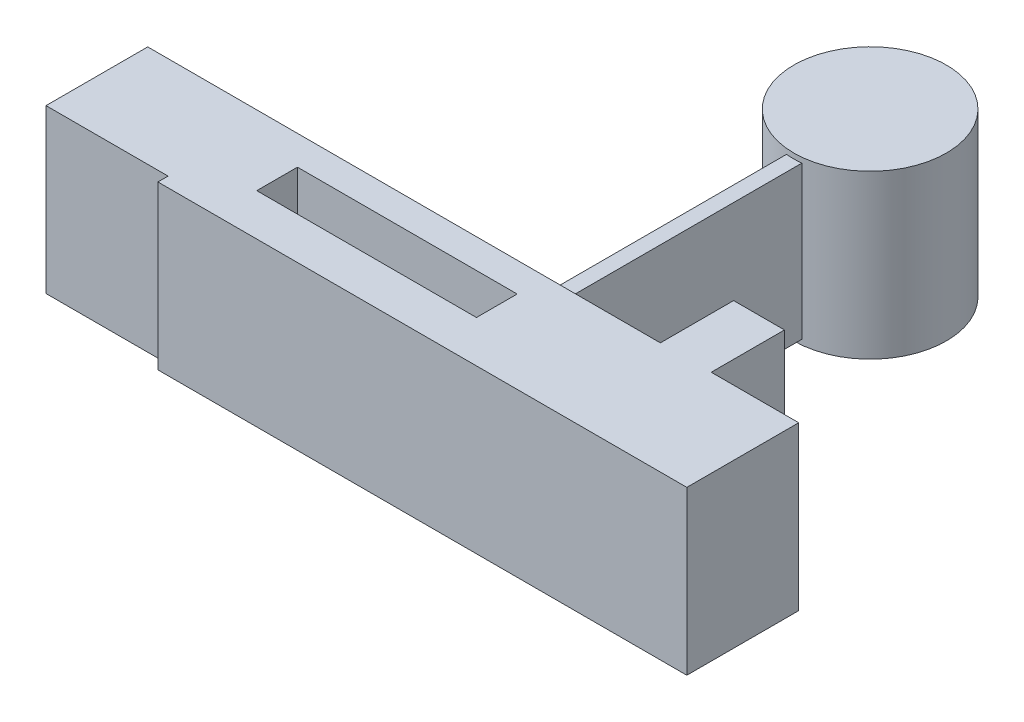
ISO-10303-21;
HEADER;
FILE_DESCRIPTION(('STEP AP214'),'2;1');
FILE_NAME('part.step','',(''),(''),'','','');
FILE_SCHEMA(('AUTOMOTIVE_DESIGN { 1 0 10303 214 1 1 1 1 }'));
ENDSEC;
DATA;
#1=APPLICATION_CONTEXT('core data for automotive mechanical design processes');
#2=APPLICATION_PROTOCOL_DEFINITION('international standard','automotive_design',2000,#1);
#3=PRODUCT_CONTEXT('',#1,'mechanical');
#4=PRODUCT('Part','Part','',(#3));
#5=PRODUCT_RELATED_PRODUCT_CATEGORY('part','',(#4));
#6=PRODUCT_DEFINITION_FORMATION('','',#4);
#7=PRODUCT_DEFINITION_CONTEXT('part definition',#1,'design');
#8=PRODUCT_DEFINITION('design','',#6,#7);
#9=PRODUCT_DEFINITION_SHAPE('','',#8);
#10=(LENGTH_UNIT() NAMED_UNIT(*) SI_UNIT(.MILLI.,.METRE.));
#11=(NAMED_UNIT(*) PLANE_ANGLE_UNIT() SI_UNIT($,.RADIAN.));
#12=(NAMED_UNIT(*) SI_UNIT($,.STERADIAN.) SOLID_ANGLE_UNIT());
#13=UNCERTAINTY_MEASURE_WITH_UNIT(LENGTH_MEASURE(1.E-05),#10,'distance_accuracy_value','');
#14=(GEOMETRIC_REPRESENTATION_CONTEXT(3) GLOBAL_UNCERTAINTY_ASSIGNED_CONTEXT((#13)) GLOBAL_UNIT_ASSIGNED_CONTEXT((#10,
#11,#12)) REPRESENTATION_CONTEXT('',''));
#15=CARTESIAN_POINT('',(0.,0.,0.));
#16=DIRECTION('',(0.,0.,1.));
#17=DIRECTION('',(1.,0.,0.));
#18=AXIS2_PLACEMENT_3D('',#15,#16,#17);
#19=CARTESIAN_POINT('',(2.55,0.5,-1.88875));
#20=DIRECTION('',(0.,1.,0.));
#21=DIRECTION('',(1.,0.,0.));
#22=AXIS2_PLACEMENT_3D('',#19,#20,#21);
#23=PLANE('',#22);
#24=CARTESIAN_POINT('',(2.55,0.5,-1.88875));
#25=DIRECTION('',(0.,1.,0.));
#26=DIRECTION('',(0.,0.,1.));
#27=AXIS2_PLACEMENT_3D('',#24,#25,#26);
#28=CIRCLE('',#27,0.46875);
#29=CARTESIAN_POINT('',(2.55,0.5,-1.42));
#30=VERTEX_POINT('',#29);
#31=EDGE_CURVE('E37',#30,#30,#28,.T.);
#32=ORIENTED_EDGE('',*,*,#31,.T.);
#33=EDGE_LOOP('',(#32));
#34=FACE_BOUND('',#33,.T.);
#35=ADVANCED_FACE('F15',(#34),#23,.T.);
#36=CARTESIAN_POINT('',(2.55,-0.5,-1.88875));
#37=DIRECTION('',(0.,1.,0.));
#38=DIRECTION('',(1.,0.,0.));
#39=AXIS2_PLACEMENT_3D('',#36,#37,#38);
#40=PLANE('',#39);
#41=CARTESIAN_POINT('',(2.55,-0.5,-1.88875));
#42=DIRECTION('',(0.,1.,0.));
#43=DIRECTION('',(0.,0.,1.));
#44=AXIS2_PLACEMENT_3D('',#41,#42,#43);
#45=CIRCLE('',#44,0.46875);
#46=CARTESIAN_POINT('',(2.55,-0.5,-1.42));
#47=VERTEX_POINT('',#46);
#48=EDGE_CURVE('E9',#47,#47,#45,.T.);
#49=ORIENTED_EDGE('',*,*,#48,.F.);
#50=EDGE_LOOP('',(#49));
#51=FACE_BOUND('',#50,.T.);
#52=ADVANCED_FACE('F483',(#51),#40,.F.);
#53=CARTESIAN_POINT('',(2.55,-0.5,-1.88875));
#54=DIRECTION('',(0.,1.,0.));
#55=DIRECTION('',(0.,0.,1.));
#56=AXIS2_PLACEMENT_3D('',#53,#54,#55);
#57=CYLINDRICAL_SURFACE('',#56,0.46875);
#58=DIRECTION('',(0.,1.,0.));
#59=VECTOR('',#58,1.);
#60=CARTESIAN_POINT('',(2.55,-0.5,-1.42));
#61=LINE('',#60,#59);
#62=CARTESIAN_POINT('',(2.55,0.46875,-1.42));
#63=VERTEX_POINT('',#62);
#64=EDGE_CURVE('E412',#63,#30,#61,.T.);
#65=ORIENTED_EDGE('',*,*,#64,.T.);
#66=ORIENTED_EDGE('',*,*,#31,.F.);
#67=ORIENTED_EDGE('',*,*,#64,.F.);
#68=CARTESIAN_POINT('',(2.55,0.46875,-1.88875));
#69=DIRECTION('',(0.,1.,0.));
#70=DIRECTION('',(0.,0.,1.));
#71=AXIS2_PLACEMENT_3D('',#68,#69,#70);
#72=CIRCLE('',#71,0.46875);
#73=CARTESIAN_POINT('',(2.596875,0.46875,-1.422349638856));
#74=VERTEX_POINT('',#73);
#75=EDGE_CURVE('E388',#63,#74,#72,.T.);
#76=ORIENTED_EDGE('',*,*,#75,.T.);
#77=DIRECTION('',(0.,1.,0.));
#78=VECTOR('',#77,1.);
#79=CARTESIAN_POINT('',(2.596875,-0.5,-1.422349638856));
#80=LINE('',#79,#78);
#81=CARTESIAN_POINT('',(2.596875,-0.46875,-1.422349638856));
#82=VERTEX_POINT('',#81);
#83=EDGE_CURVE('E404',#82,#74,#80,.T.);
#84=ORIENTED_EDGE('',*,*,#83,.F.);
#85=CARTESIAN_POINT('',(2.55,-0.46875,-1.88875));
#86=DIRECTION('',(0.,1.,0.));
#87=DIRECTION('',(0.,0.,1.));
#88=AXIS2_PLACEMENT_3D('',#85,#86,#87);
#89=CIRCLE('',#88,0.46875);
#90=CARTESIAN_POINT('',(2.55,-0.46875,-1.42));
#91=VERTEX_POINT('',#90);
#92=EDGE_CURVE('E398',#91,#82,#89,.T.);
#93=ORIENTED_EDGE('',*,*,#92,.F.);
#94=DIRECTION('',(0.,1.,0.));
#95=VECTOR('',#94,1.);
#96=CARTESIAN_POINT('',(2.55,-0.5,-1.42));
#97=LINE('',#96,#95);
#98=EDGE_CURVE('E23',#47,#91,#97,.T.);
#99=ORIENTED_EDGE('',*,*,#98,.F.);
#100=ORIENTED_EDGE('',*,*,#48,.T.);
#101=ORIENTED_EDGE('',*,*,#98,.T.);
#102=CARTESIAN_POINT('',(2.55,-0.46875,-1.88875));
#103=DIRECTION('',(0.,1.,0.));
#104=DIRECTION('',(0.,0.,1.));
#105=AXIS2_PLACEMENT_3D('',#102,#103,#104);
#106=CIRCLE('',#105,0.46875);
#107=CARTESIAN_POINT('',(2.503125,-0.46875,-1.422349638856));
#108=VERTEX_POINT('',#107);
#109=EDGE_CURVE('E393',#108,#91,#106,.T.);
#110=ORIENTED_EDGE('',*,*,#109,.F.);
#111=DIRECTION('',(0.,1.,0.));
#112=VECTOR('',#111,1.);
#113=CARTESIAN_POINT('',(2.503125,-0.5,-1.422349638856));
#114=LINE('',#113,#112);
#115=CARTESIAN_POINT('',(2.503125,0.46875,-1.422349638856));
#116=VERTEX_POINT('',#115);
#117=EDGE_CURVE('E379',#108,#116,#114,.T.);
#118=ORIENTED_EDGE('',*,*,#117,.T.);
#119=CARTESIAN_POINT('',(2.55,0.46875,-1.88875));
#120=DIRECTION('',(0.,1.,0.));
#121=DIRECTION('',(0.,0.,1.));
#122=AXIS2_PLACEMENT_3D('',#119,#120,#121);
#123=CIRCLE('',#122,0.46875);
#124=EDGE_CURVE('E240',#116,#63,#123,.T.);
#125=ORIENTED_EDGE('',*,*,#124,.T.);
#126=EDGE_LOOP('',(#65,#66,#67,#76,#84,#93,#99,#100,#101,#110,#118,#125));
#127=FACE_BOUND('',#126,.T.);
#128=ADVANCED_FACE('F420',(#127),#57,.T.);
#129=CARTESIAN_POINT('',(3.4625,-0.5,-0.45));
#130=DIRECTION('',(1.,0.,0.));
#131=DIRECTION('',(0.,1.,0.));
#132=AXIS2_PLACEMENT_3D('',#129,#130,#131);
#133=PLANE('',#132);
#134=DIRECTION('',(0.,0.,1.));
#135=VECTOR('',#134,1.);
#136=CARTESIAN_POINT('',(3.4625,-0.5,-0.45));
#137=LINE('',#136,#135);
#138=CARTESIAN_POINT('',(3.4625,-0.5,-0.45));
#139=VERTEX_POINT('',#138);
#140=CARTESIAN_POINT('',(3.4625,-0.5,0.));
#141=VERTEX_POINT('',#140);
#142=EDGE_CURVE('E256',#139,#141,#137,.T.);
#143=ORIENTED_EDGE('',*,*,#142,.F.);
#144=DIRECTION('',(0.,1.,0.));
#145=VECTOR('',#144,1.);
#146=CARTESIAN_POINT('',(3.4625,-0.5,-0.45));
#147=LINE('',#146,#145);
#148=CARTESIAN_POINT('',(3.4625,0.5,-0.45));
#149=VERTEX_POINT('',#148);
#150=EDGE_CURVE('E407',#139,#149,#147,.T.);
#151=ORIENTED_EDGE('',*,*,#150,.T.);
#152=DIRECTION('',(0.,0.,1.));
#153=VECTOR('',#152,1.);
#154=CARTESIAN_POINT('',(3.4625,0.5,-0.45));
#155=LINE('',#154,#153);
#156=CARTESIAN_POINT('',(3.4625,0.5,0.));
#157=VERTEX_POINT('',#156);
#158=EDGE_CURVE('E317',#149,#157,#155,.T.);
#159=ORIENTED_EDGE('',*,*,#158,.T.);
#160=DIRECTION('',(0.,1.,0.));
#161=VECTOR('',#160,1.);
#162=CARTESIAN_POINT('',(3.4625,-0.5,0.));
#163=LINE('',#162,#161);
#164=EDGE_CURVE('E239',#141,#157,#163,.T.);
#165=ORIENTED_EDGE('',*,*,#164,.F.);
#166=EDGE_LOOP('',(#143,#151,#159,#165));
#167=FACE_BOUND('',#166,.T.);
#168=ADVANCED_FACE('F456',(#167),#133,.T.);
#169=CARTESIAN_POINT('',(3.15,-0.5,-0.45));
#170=DIRECTION('',(0.,0.,1.));
#171=DIRECTION('',(1.,0.,0.));
#172=AXIS2_PLACEMENT_3D('',#169,#170,#171);
#173=PLANE('',#172);
#174=DIRECTION('',(1.,0.,0.));
#175=VECTOR('',#174,1.);
#176=CARTESIAN_POINT('',(3.15,0.5,-0.45));
#177=LINE('',#176,#175);
#178=CARTESIAN_POINT('',(3.15,0.5,-0.45));
#179=VERTEX_POINT('',#178);
#180=EDGE_CURVE('E323',#179,#149,#177,.T.);
#181=ORIENTED_EDGE('',*,*,#180,.T.);
#182=ORIENTED_EDGE('',*,*,#150,.F.);
#183=DIRECTION('',(1.,0.,0.));
#184=VECTOR('',#183,1.);
#185=CARTESIAN_POINT('',(3.15,-0.5,-0.45));
#186=LINE('',#185,#184);
#187=CARTESIAN_POINT('',(3.15,-0.5,-0.45));
#188=VERTEX_POINT('',#187);
#189=EDGE_CURVE('E260',#188,#139,#186,.T.);
#190=ORIENTED_EDGE('',*,*,#189,.F.);
#191=DIRECTION('',(0.,1.,0.));
#192=VECTOR('',#191,1.);
#193=CARTESIAN_POINT('',(3.15,-0.5,-0.45));
#194=LINE('',#193,#192);
#195=EDGE_CURVE('E372',#188,#179,#194,.T.);
#196=ORIENTED_EDGE('',*,*,#195,.T.);
#197=EDGE_LOOP('',(#181,#182,#190,#196));
#198=FACE_BOUND('',#197,.T.);
#199=ADVANCED_FACE('F453',(#198),#173,.F.);
#200=CARTESIAN_POINT('',(2.596875,-0.46875,-1.5));
#201=DIRECTION('',(1.,0.,0.));
#202=DIRECTION('',(0.,1.,0.));
#203=AXIS2_PLACEMENT_3D('',#200,#201,#202);
#204=PLANE('',#203);
#205=DIRECTION('',(0.,0.,1.));
#206=VECTOR('',#205,1.);
#207=CARTESIAN_POINT('',(2.596875,-0.46875,-1.5));
#208=LINE('',#207,#206);
#209=CARTESIAN_POINT('',(2.596875,-0.46875,0.));
#210=VERTEX_POINT('',#209);
#211=EDGE_CURVE('E401',#82,#210,#208,.T.);
#212=ORIENTED_EDGE('',*,*,#211,.F.);
#213=ORIENTED_EDGE('',*,*,#83,.T.);
#214=DIRECTION('',(0.,0.,1.));
#215=VECTOR('',#214,1.);
#216=CARTESIAN_POINT('',(2.596875,0.46875,-1.5));
#217=LINE('',#216,#215);
#218=CARTESIAN_POINT('',(2.596875,0.46875,0.));
#219=VERTEX_POINT('',#218);
#220=EDGE_CURVE('E390',#74,#219,#217,.T.);
#221=ORIENTED_EDGE('',*,*,#220,.T.);
#222=DIRECTION('',(0.,1.,0.));
#223=VECTOR('',#222,1.);
#224=CARTESIAN_POINT('',(2.596875,-0.46875,0.));
#225=LINE('',#224,#223);
#226=EDGE_CURVE('E351',#210,#219,#225,.T.);
#227=ORIENTED_EDGE('',*,*,#226,.F.);
#228=EDGE_LOOP('',(#212,#213,#221,#227));
#229=FACE_BOUND('',#228,.T.);
#230=ADVANCED_FACE('F437',(#229),#204,.T.);
#231=CARTESIAN_POINT('',(2.503125,-0.46875,-1.5));
#232=DIRECTION('',(0.,1.,0.));
#233=DIRECTION('',(1.,0.,0.));
#234=AXIS2_PLACEMENT_3D('',#231,#232,#233);
#235=PLANE('',#234);
#236=DIRECTION('',(1.,0.,0.));
#237=VECTOR('',#236,1.);
#238=CARTESIAN_POINT('',(2.503125,-0.46875,0.));
#239=LINE('',#238,#237);
#240=CARTESIAN_POINT('',(2.503125,-0.46875,0.));
#241=VERTEX_POINT('',#240);
#242=EDGE_CURVE('E346',#241,#210,#239,.T.);
#243=ORIENTED_EDGE('',*,*,#242,.F.);
#244=DIRECTION('',(0.,0.,1.));
#245=VECTOR('',#244,1.);
#246=CARTESIAN_POINT('',(2.503125,-0.46875,-1.5));
#247=LINE('',#246,#245);
#248=EDGE_CURVE('E383',#108,#241,#247,.T.);
#249=ORIENTED_EDGE('',*,*,#248,.F.);
#250=ORIENTED_EDGE('',*,*,#109,.T.);
#251=ORIENTED_EDGE('',*,*,#92,.T.);
#252=ORIENTED_EDGE('',*,*,#211,.T.);
#253=EDGE_LOOP('',(#243,#249,#250,#251,#252));
#254=FACE_BOUND('',#253,.T.);
#255=ADVANCED_FACE('F424',(#254),#235,.F.);
#256=CARTESIAN_POINT('',(2.503125,0.46875,-1.5));
#257=DIRECTION('',(0.,1.,0.));
#258=DIRECTION('',(1.,0.,0.));
#259=AXIS2_PLACEMENT_3D('',#256,#257,#258);
#260=PLANE('',#259);
#261=ORIENTED_EDGE('',*,*,#220,.F.);
#262=ORIENTED_EDGE('',*,*,#75,.F.);
#263=ORIENTED_EDGE('',*,*,#124,.F.);
#264=DIRECTION('',(0.,0.,1.));
#265=VECTOR('',#264,1.);
#266=CARTESIAN_POINT('',(2.503125,0.46875,-1.5));
#267=LINE('',#266,#265);
#268=CARTESIAN_POINT('',(2.503125,0.46875,0.));
#269=VERTEX_POINT('',#268);
#270=EDGE_CURVE('E380',#116,#269,#267,.T.);
#271=ORIENTED_EDGE('',*,*,#270,.T.);
#272=DIRECTION('',(1.,0.,0.));
#273=VECTOR('',#272,1.);
#274=CARTESIAN_POINT('',(2.503125,0.46875,0.));
#275=LINE('',#274,#273);
#276=EDGE_CURVE('E354',#269,#219,#275,.T.);
#277=ORIENTED_EDGE('',*,*,#276,.T.);
#278=EDGE_LOOP('',(#261,#262,#263,#271,#277));
#279=FACE_BOUND('',#278,.T.);
#280=ADVANCED_FACE('F432',(#279),#260,.T.);
#281=CARTESIAN_POINT('',(2.503125,-0.46875,-1.5));
#282=DIRECTION('',(1.,0.,0.));
#283=DIRECTION('',(0.,1.,0.));
#284=AXIS2_PLACEMENT_3D('',#281,#282,#283);
#285=PLANE('',#284);
#286=DIRECTION('',(0.,1.,0.));
#287=VECTOR('',#286,1.);
#288=CARTESIAN_POINT('',(2.503125,-0.46875,0.));
#289=LINE('',#288,#287);
#290=EDGE_CURVE('E282',#241,#269,#289,.T.);
#291=ORIENTED_EDGE('',*,*,#290,.T.);
#292=ORIENTED_EDGE('',*,*,#270,.F.);
#293=ORIENTED_EDGE('',*,*,#117,.F.);
#294=ORIENTED_EDGE('',*,*,#248,.T.);
#295=EDGE_LOOP('',(#291,#292,#293,#294));
#296=FACE_BOUND('',#295,.T.);
#297=ADVANCED_FACE('F427',(#296),#285,.F.);
#298=CARTESIAN_POINT('',(3.15,-0.5,-0.45));
#299=DIRECTION('',(1.,0.,0.));
#300=DIRECTION('',(0.,1.,0.));
#301=AXIS2_PLACEMENT_3D('',#298,#299,#300);
#302=PLANE('',#301);
#303=DIRECTION('',(0.,1.,0.));
#304=VECTOR('',#303,1.);
#305=CARTESIAN_POINT('',(3.15,-0.5,0.));
#306=LINE('',#305,#304);
#307=CARTESIAN_POINT('',(3.15,-0.5,0.));
#308=VERTEX_POINT('',#307);
#309=CARTESIAN_POINT('',(3.15,0.5,0.));
#310=VERTEX_POINT('',#309);
#311=EDGE_CURVE('E342',#308,#310,#306,.T.);
#312=ORIENTED_EDGE('',*,*,#311,.T.);
#313=DIRECTION('',(0.,0.,1.));
#314=VECTOR('',#313,1.);
#315=CARTESIAN_POINT('',(3.15,0.5,-0.45));
#316=LINE('',#315,#314);
#317=EDGE_CURVE('E330',#179,#310,#316,.T.);
#318=ORIENTED_EDGE('',*,*,#317,.F.);
#319=ORIENTED_EDGE('',*,*,#195,.F.);
#320=DIRECTION('',(0.,0.,1.));
#321=VECTOR('',#320,1.);
#322=CARTESIAN_POINT('',(3.15,-0.5,-0.45));
#323=LINE('',#322,#321);
#324=EDGE_CURVE('E219',#188,#308,#323,.T.);
#325=ORIENTED_EDGE('',*,*,#324,.T.);
#326=EDGE_LOOP('',(#312,#318,#319,#325));
#327=FACE_BOUND('',#326,.T.);
#328=ADVANCED_FACE('F448',(#327),#302,.F.);
#329=CARTESIAN_POINT('',(1.1,-0.55,0.18));
#330=DIRECTION('',(1.,0.,0.));
#331=DIRECTION('',(0.,1.,0.));
#332=AXIS2_PLACEMENT_3D('',#329,#330,#331);
#333=PLANE('',#332);
#334=DIRECTION('',(0.,1.,0.));
#335=VECTOR('',#334,1.);
#336=CARTESIAN_POINT('',(1.1,-0.55,0.43));
#337=LINE('',#336,#335);
#338=CARTESIAN_POINT('',(1.1,-0.5,0.43));
#339=VERTEX_POINT('',#338);
#340=CARTESIAN_POINT('',(1.1,0.5,0.43));
#341=VERTEX_POINT('',#340);
#342=EDGE_CURVE('E250',#339,#341,#337,.T.);
#343=ORIENTED_EDGE('',*,*,#342,.F.);
#344=DIRECTION('',(0.,0.,-1.));
#345=VECTOR('',#344,1.);
#346=CARTESIAN_POINT('',(1.1,-0.5,0.09));
#347=LINE('',#346,#345);
#348=CARTESIAN_POINT('',(1.1,-0.5,0.18));
#349=VERTEX_POINT('',#348);
#350=EDGE_CURVE('E249',#339,#349,#347,.T.);
#351=ORIENTED_EDGE('',*,*,#350,.T.);
#352=DIRECTION('',(0.,1.,0.));
#353=VECTOR('',#352,1.);
#354=CARTESIAN_POINT('',(1.1,-0.55,0.18));
#355=LINE('',#354,#353);
#356=CARTESIAN_POINT('',(1.1,0.5,0.18));
#357=VERTEX_POINT('',#356);
#358=EDGE_CURVE('E371',#349,#357,#355,.T.);
#359=ORIENTED_EDGE('',*,*,#358,.T.);
#360=DIRECTION('',(0.,0.,-1.));
#361=VECTOR('',#360,1.);
#362=CARTESIAN_POINT('',(1.1,0.5,0.09));
#363=LINE('',#362,#361);
#364=EDGE_CURVE('E273',#341,#357,#363,.T.);
#365=ORIENTED_EDGE('',*,*,#364,.F.);
#366=EDGE_LOOP('',(#343,#351,#359,#365));
#367=FACE_BOUND('',#366,.T.);
#368=ADVANCED_FACE('F510',(#367),#333,.T.);
#369=CARTESIAN_POINT('',(1.1,-0.55,0.18));
#370=DIRECTION('',(0.,0.,1.));
#371=DIRECTION('',(1.,0.,0.));
#372=AXIS2_PLACEMENT_3D('',#369,#370,#371);
#373=PLANE('',#372);
#374=ORIENTED_EDGE('',*,*,#358,.F.);
#375=DIRECTION('',(1.,0.,0.));
#376=VECTOR('',#375,1.);
#377=CARTESIAN_POINT('',(0.55,-0.5,0.18));
#378=LINE('',#377,#376);
#379=CARTESIAN_POINT('',(2.45,-0.5,0.18));
#380=VERTEX_POINT('',#379);
#381=EDGE_CURVE('E252',#349,#380,#378,.T.);
#382=ORIENTED_EDGE('',*,*,#381,.T.);
#383=DIRECTION('',(0.,1.,0.));
#384=VECTOR('',#383,1.);
#385=CARTESIAN_POINT('',(2.45,-0.55,0.18));
#386=LINE('',#385,#384);
#387=CARTESIAN_POINT('',(2.45,0.5,0.18));
#388=VERTEX_POINT('',#387);
#389=EDGE_CURVE('E366',#380,#388,#386,.T.);
#390=ORIENTED_EDGE('',*,*,#389,.T.);
#391=DIRECTION('',(1.,0.,0.));
#392=VECTOR('',#391,1.);
#393=CARTESIAN_POINT('',(0.55,0.5,0.18));
#394=LINE('',#393,#392);
#395=EDGE_CURVE('E267',#357,#388,#394,.T.);
#396=ORIENTED_EDGE('',*,*,#395,.F.);
#397=EDGE_LOOP('',(#374,#382,#390,#396));
#398=FACE_BOUND('',#397,.T.);
#399=ADVANCED_FACE('F512',(#398),#373,.T.);
#400=CARTESIAN_POINT('',(2.45,-0.55,0.18));
#401=DIRECTION('',(1.,0.,0.));
#402=DIRECTION('',(0.,1.,0.));
#403=AXIS2_PLACEMENT_3D('',#400,#401,#402);
#404=PLANE('',#403);
#405=DIRECTION('',(0.,0.,-1.));
#406=VECTOR('',#405,1.);
#407=CARTESIAN_POINT('',(2.45,0.5,0.09));
#408=LINE('',#407,#406);
#409=CARTESIAN_POINT('',(2.45,0.5,0.43));
#410=VERTEX_POINT('',#409);
#411=EDGE_CURVE('E272',#410,#388,#408,.T.);
#412=ORIENTED_EDGE('',*,*,#411,.T.);
#413=ORIENTED_EDGE('',*,*,#389,.F.);
#414=DIRECTION('',(0.,0.,-1.));
#415=VECTOR('',#414,1.);
#416=CARTESIAN_POINT('',(2.45,-0.5,0.09));
#417=LINE('',#416,#415);
#418=CARTESIAN_POINT('',(2.45,-0.5,0.43));
#419=VERTEX_POINT('',#418);
#420=EDGE_CURVE('E268',#419,#380,#417,.T.);
#421=ORIENTED_EDGE('',*,*,#420,.F.);
#422=DIRECTION('',(0.,1.,0.));
#423=VECTOR('',#422,1.);
#424=CARTESIAN_POINT('',(2.45,-0.55,0.43));
#425=LINE('',#424,#423);
#426=EDGE_CURVE('E243',#419,#410,#425,.T.);
#427=ORIENTED_EDGE('',*,*,#426,.T.);
#428=EDGE_LOOP('',(#412,#413,#421,#427));
#429=FACE_BOUND('',#428,.T.);
#430=ADVANCED_FACE('F515',(#429),#404,.F.);
#431=CARTESIAN_POINT('',(1.1,-0.55,0.43));
#432=DIRECTION('',(0.,0.,1.));
#433=DIRECTION('',(1.,0.,0.));
#434=AXIS2_PLACEMENT_3D('',#431,#432,#433);
#435=PLANE('',#434);
#436=DIRECTION('',(1.,0.,0.));
#437=VECTOR('',#436,1.);
#438=CARTESIAN_POINT('',(0.55,0.5,0.43));
#439=LINE('',#438,#437);
#440=EDGE_CURVE('E331',#341,#410,#439,.T.);
#441=ORIENTED_EDGE('',*,*,#440,.T.);
#442=ORIENTED_EDGE('',*,*,#426,.F.);
#443=DIRECTION('',(1.,0.,0.));
#444=VECTOR('',#443,1.);
#445=CARTESIAN_POINT('',(0.55,-0.5,0.43));
#446=LINE('',#445,#444);
#447=EDGE_CURVE('E253',#339,#419,#446,.T.);
#448=ORIENTED_EDGE('',*,*,#447,.F.);
#449=ORIENTED_EDGE('',*,*,#342,.T.);
#450=EDGE_LOOP('',(#441,#442,#448,#449));
#451=FACE_BOUND('',#450,.T.);
#452=ADVANCED_FACE('F509',(#451),#435,.F.);
#453=CARTESIAN_POINT('',(0.75,-0.5,0.));
#454=DIRECTION('',(1.,0.,0.));
#455=DIRECTION('',(0.,1.,0.));
#456=AXIS2_PLACEMENT_3D('',#453,#454,#455);
#457=PLANE('',#456);
#458=DIRECTION('',(0.,1.,0.));
#459=VECTOR('',#458,1.);
#460=CARTESIAN_POINT('',(0.75,-0.5,0.6875));
#461=LINE('',#460,#459);
#462=CARTESIAN_POINT('',(0.75,-0.5,0.6875));
#463=VERTEX_POINT('',#462);
#464=CARTESIAN_POINT('',(0.75,0.5,0.6875));
#465=VERTEX_POINT('',#464);
#466=EDGE_CURVE('E237',#463,#465,#461,.T.);
#467=ORIENTED_EDGE('',*,*,#466,.T.);
#468=DIRECTION('',(0.,0.,1.));
#469=VECTOR('',#468,1.);
#470=CARTESIAN_POINT('',(0.75,0.5,0.));
#471=LINE('',#470,#469);
#472=CARTESIAN_POINT('',(0.75,0.5,0.625));
#473=VERTEX_POINT('',#472);
#474=EDGE_CURVE('E304',#473,#465,#471,.T.);
#475=ORIENTED_EDGE('',*,*,#474,.F.);
#476=DIRECTION('',(0.,1.,0.));
#477=VECTOR('',#476,1.);
#478=CARTESIAN_POINT('',(0.75,-0.5,0.625));
#479=LINE('',#478,#477);
#480=CARTESIAN_POINT('',(0.75,-0.5,0.625));
#481=VERTEX_POINT('',#480);
#482=EDGE_CURVE('E297',#481,#473,#479,.T.);
#483=ORIENTED_EDGE('',*,*,#482,.F.);
#484=DIRECTION('',(0.,0.,1.));
#485=VECTOR('',#484,1.);
#486=CARTESIAN_POINT('',(0.75,-0.5,0.));
#487=LINE('',#486,#485);
#488=EDGE_CURVE('E202',#481,#463,#487,.T.);
#489=ORIENTED_EDGE('',*,*,#488,.T.);
#490=EDGE_LOOP('',(#467,#475,#483,#489));
#491=FACE_BOUND('',#490,.T.);
#492=ADVANCED_FACE('F466',(#491),#457,.F.);
#493=CARTESIAN_POINT('',(0.75,-0.5,0.6875));
#494=DIRECTION('',(0.,0.,1.));
#495=DIRECTION('',(1.,0.,0.));
#496=AXIS2_PLACEMENT_3D('',#493,#494,#495);
#497=PLANE('',#496);
#498=ORIENTED_EDGE('',*,*,#466,.F.);
#499=DIRECTION('',(1.,0.,0.));
#500=VECTOR('',#499,1.);
#501=CARTESIAN_POINT('',(0.75,-0.5,0.6875));
#502=LINE('',#501,#500);
#503=CARTESIAN_POINT('',(4.,-0.5,0.6875));
#504=VERTEX_POINT('',#503);
#505=EDGE_CURVE('E286',#463,#504,#502,.T.);
#506=ORIENTED_EDGE('',*,*,#505,.T.);
#507=DIRECTION('',(0.,1.,0.));
#508=VECTOR('',#507,1.);
#509=CARTESIAN_POINT('',(4.,-0.5,0.6875));
#510=LINE('',#509,#508);
#511=CARTESIAN_POINT('',(4.,0.5,0.6875));
#512=VERTEX_POINT('',#511);
#513=EDGE_CURVE('E238',#504,#512,#510,.T.);
#514=ORIENTED_EDGE('',*,*,#513,.T.);
#515=DIRECTION('',(1.,0.,0.));
#516=VECTOR('',#515,1.);
#517=CARTESIAN_POINT('',(0.75,0.5,0.6875));
#518=LINE('',#517,#516);
#519=EDGE_CURVE('E307',#465,#512,#518,.T.);
#520=ORIENTED_EDGE('',*,*,#519,.F.);
#521=EDGE_LOOP('',(#498,#506,#514,#520));
#522=FACE_BOUND('',#521,.T.);
#523=ADVANCED_FACE('F467',(#522),#497,.T.);
#524=CARTESIAN_POINT('',(4.,-0.5,0.));
#525=DIRECTION('',(1.,0.,0.));
#526=DIRECTION('',(0.,1.,0.));
#527=AXIS2_PLACEMENT_3D('',#524,#525,#526);
#528=PLANE('',#527);
#529=DIRECTION('',(0.,0.,1.));
#530=VECTOR('',#529,1.);
#531=CARTESIAN_POINT('',(4.,-0.5,0.));
#532=LINE('',#531,#530);
#533=CARTESIAN_POINT('',(4.,-0.5,0.));
#534=VERTEX_POINT('',#533);
#535=EDGE_CURVE('E279',#534,#504,#532,.T.);
#536=ORIENTED_EDGE('',*,*,#535,.F.);
#537=DIRECTION('',(0.,1.,0.));
#538=VECTOR('',#537,1.);
#539=CARTESIAN_POINT('',(4.,-0.5,0.));
#540=LINE('',#539,#538);
#541=CARTESIAN_POINT('',(4.,0.5,0.));
#542=VERTEX_POINT('',#541);
#543=EDGE_CURVE('E276',#534,#542,#540,.T.);
#544=ORIENTED_EDGE('',*,*,#543,.T.);
#545=DIRECTION('',(0.,0.,1.));
#546=VECTOR('',#545,1.);
#547=CARTESIAN_POINT('',(4.,0.5,0.));
#548=LINE('',#547,#546);
#549=EDGE_CURVE('E313',#542,#512,#548,.T.);
#550=ORIENTED_EDGE('',*,*,#549,.T.);
#551=ORIENTED_EDGE('',*,*,#513,.F.);
#552=EDGE_LOOP('',(#536,#544,#550,#551));
#553=FACE_BOUND('',#552,.T.);
#554=ADVANCED_FACE('F463',(#553),#528,.T.);
#555=CARTESIAN_POINT('',(0.,-0.5,0.));
#556=DIRECTION('',(0.,0.,1.));
#557=DIRECTION('',(1.,0.,0.));
#558=AXIS2_PLACEMENT_3D('',#555,#556,#557);
#559=PLANE('',#558);
#560=ORIENTED_EDGE('',*,*,#543,.F.);
#561=DIRECTION('',(1.,0.,0.));
#562=VECTOR('',#561,1.);
#563=CARTESIAN_POINT('',(0.,-0.5,0.));
#564=LINE('',#563,#562);
#565=EDGE_CURVE('E265',#141,#534,#564,.T.);
#566=ORIENTED_EDGE('',*,*,#565,.F.);
#567=ORIENTED_EDGE('',*,*,#164,.T.);
#568=DIRECTION('',(-1.,0.,0.));
#569=VECTOR('',#568,1.);
#570=CARTESIAN_POINT('',(4.,0.5,0.));
#571=LINE('',#570,#569);
#572=EDGE_CURVE('E312',#542,#157,#571,.T.);
#573=ORIENTED_EDGE('',*,*,#572,.F.);
#574=EDGE_LOOP('',(#560,#566,#567,#573));
#575=FACE_BOUND('',#574,.T.);
#576=ADVANCED_FACE('F441',(#575),#559,.F.);
#577=CARTESIAN_POINT('',(0.,-0.5,0.));
#578=DIRECTION('',(0.,0.,1.));
#579=DIRECTION('',(1.,0.,0.));
#580=AXIS2_PLACEMENT_3D('',#577,#578,#579);
#581=PLANE('',#580);
#582=ORIENTED_EDGE('',*,*,#242,.T.);
#583=ORIENTED_EDGE('',*,*,#226,.T.);
#584=ORIENTED_EDGE('',*,*,#276,.F.);
#585=ORIENTED_EDGE('',*,*,#290,.F.);
#586=EDGE_LOOP('',(#582,#583,#584,#585));
#587=FACE_BOUND('',#586,.T.);
#588=ORIENTED_EDGE('',*,*,#311,.F.);
#589=DIRECTION('',(1.,0.,0.));
#590=VECTOR('',#589,1.);
#591=CARTESIAN_POINT('',(0.,-0.5,0.));
#592=LINE('',#591,#590);
#593=CARTESIAN_POINT('',(0.,-0.5,0.));
#594=VERTEX_POINT('',#593);
#595=EDGE_CURVE('E209',#594,#308,#592,.T.);
#596=ORIENTED_EDGE('',*,*,#595,.F.);
#597=DIRECTION('',(0.,1.,0.));
#598=VECTOR('',#597,1.);
#599=CARTESIAN_POINT('',(0.,-0.5,0.));
#600=LINE('',#599,#598);
#601=CARTESIAN_POINT('',(0.,0.5,0.));
#602=VERTEX_POINT('',#601);
#603=EDGE_CURVE('E217',#594,#602,#600,.T.);
#604=ORIENTED_EDGE('',*,*,#603,.T.);
#605=DIRECTION('',(-1.,0.,0.));
#606=VECTOR('',#605,1.);
#607=CARTESIAN_POINT('',(4.,0.5,0.));
#608=LINE('',#607,#606);
#609=EDGE_CURVE('E332',#310,#602,#608,.T.);
#610=ORIENTED_EDGE('',*,*,#609,.F.);
#611=EDGE_LOOP('',(#588,#596,#604,#610));
#612=FACE_BOUND('',#611,.T.);
#613=ADVANCED_FACE('F439',(#587,#612),#581,.F.);
#614=CARTESIAN_POINT('',(0.,0.5,0.));
#615=DIRECTION('',(0.,1.,0.));
#616=DIRECTION('',(1.,0.,0.));
#617=AXIS2_PLACEMENT_3D('',#614,#615,#616);
#618=PLANE('',#617);
#619=ORIENTED_EDGE('',*,*,#440,.F.);
#620=ORIENTED_EDGE('',*,*,#364,.T.);
#621=ORIENTED_EDGE('',*,*,#395,.T.);
#622=ORIENTED_EDGE('',*,*,#411,.F.);
#623=EDGE_LOOP('',(#619,#620,#621,#622));
#624=FACE_BOUND('',#623,.T.);
#625=DIRECTION('',(0.,0.,1.));
#626=VECTOR('',#625,1.);
#627=CARTESIAN_POINT('',(0.,0.5,0.));
#628=LINE('',#627,#626);
#629=CARTESIAN_POINT('',(0.,0.5,0.625));
#630=VERTEX_POINT('',#629);
#631=EDGE_CURVE('E227',#602,#630,#628,.T.);
#632=ORIENTED_EDGE('',*,*,#631,.T.);
#633=DIRECTION('',(1.,0.,0.));
#634=VECTOR('',#633,1.);
#635=CARTESIAN_POINT('',(0.,0.5,0.625));
#636=LINE('',#635,#634);
#637=EDGE_CURVE('E221',#630,#473,#636,.T.);
#638=ORIENTED_EDGE('',*,*,#637,.T.);
#639=ORIENTED_EDGE('',*,*,#474,.T.);
#640=ORIENTED_EDGE('',*,*,#519,.T.);
#641=ORIENTED_EDGE('',*,*,#549,.F.);
#642=ORIENTED_EDGE('',*,*,#572,.T.);
#643=ORIENTED_EDGE('',*,*,#158,.F.);
#644=ORIENTED_EDGE('',*,*,#180,.F.);
#645=ORIENTED_EDGE('',*,*,#317,.T.);
#646=ORIENTED_EDGE('',*,*,#609,.T.);
#647=EDGE_LOOP('',(#632,#638,#639,#640,#641,#642,#643,#644,#645,#646));
#648=FACE_BOUND('',#647,.T.);
#649=ADVANCED_FACE('F444',(#624,#648),#618,.T.);
#650=CARTESIAN_POINT('',(0.,-0.5,0.625));
#651=DIRECTION('',(0.,0.,1.));
#652=DIRECTION('',(1.,0.,0.));
#653=AXIS2_PLACEMENT_3D('',#650,#651,#652);
#654=PLANE('',#653);
#655=DIRECTION('',(0.,1.,0.));
#656=VECTOR('',#655,1.);
#657=CARTESIAN_POINT('',(0.,-0.5,0.625));
#658=LINE('',#657,#656);
#659=CARTESIAN_POINT('',(0.,-0.5,0.625));
#660=VERTEX_POINT('',#659);
#661=EDGE_CURVE('E216',#660,#630,#658,.T.);
#662=ORIENTED_EDGE('',*,*,#661,.F.);
#663=DIRECTION('',(1.,0.,0.));
#664=VECTOR('',#663,1.);
#665=CARTESIAN_POINT('',(0.,-0.5,0.625));
#666=LINE('',#665,#664);
#667=EDGE_CURVE('E198',#660,#481,#666,.T.);
#668=ORIENTED_EDGE('',*,*,#667,.T.);
#669=ORIENTED_EDGE('',*,*,#482,.T.);
#670=ORIENTED_EDGE('',*,*,#637,.F.);
#671=EDGE_LOOP('',(#662,#668,#669,#670));
#672=FACE_BOUND('',#671,.T.);
#673=ADVANCED_FACE('F225',(#672),#654,.T.);
#674=CARTESIAN_POINT('',(0.,-0.5,0.));
#675=DIRECTION('',(0.,1.,0.));
#676=DIRECTION('',(1.,0.,0.));
#677=AXIS2_PLACEMENT_3D('',#674,#675,#676);
#678=PLANE('',#677);
#679=ORIENTED_EDGE('',*,*,#420,.T.);
#680=ORIENTED_EDGE('',*,*,#381,.F.);
#681=ORIENTED_EDGE('',*,*,#350,.F.);
#682=ORIENTED_EDGE('',*,*,#447,.T.);
#683=EDGE_LOOP('',(#679,#680,#681,#682));
#684=FACE_BOUND('',#683,.T.);
#685=ORIENTED_EDGE('',*,*,#324,.F.);
#686=ORIENTED_EDGE('',*,*,#189,.T.);
#687=ORIENTED_EDGE('',*,*,#142,.T.);
#688=ORIENTED_EDGE('',*,*,#565,.T.);
#689=ORIENTED_EDGE('',*,*,#535,.T.);
#690=ORIENTED_EDGE('',*,*,#505,.F.);
#691=ORIENTED_EDGE('',*,*,#488,.F.);
#692=ORIENTED_EDGE('',*,*,#667,.F.);
#693=DIRECTION('',(0.,0.,1.));
#694=VECTOR('',#693,1.);
#695=CARTESIAN_POINT('',(0.,-0.5,0.));
#696=LINE('',#695,#694);
#697=EDGE_CURVE('E203',#594,#660,#696,.T.);
#698=ORIENTED_EDGE('',*,*,#697,.F.);
#699=ORIENTED_EDGE('',*,*,#595,.T.);
#700=EDGE_LOOP('',(#685,#686,#687,#688,#689,#690,#691,#692,#698,#699));
#701=FACE_BOUND('',#700,.T.);
#702=ADVANCED_FACE('F200',(#684,#701),#678,.F.);
#703=CARTESIAN_POINT('',(0.,-0.5,0.));
#704=DIRECTION('',(1.,0.,0.));
#705=DIRECTION('',(0.,1.,0.));
#706=AXIS2_PLACEMENT_3D('',#703,#704,#705);
#707=PLANE('',#706);
#708=ORIENTED_EDGE('',*,*,#661,.T.);
#709=ORIENTED_EDGE('',*,*,#631,.F.);
#710=ORIENTED_EDGE('',*,*,#603,.F.);
#711=ORIENTED_EDGE('',*,*,#697,.T.);
#712=EDGE_LOOP('',(#708,#709,#710,#711));
#713=FACE_BOUND('',#712,.T.);
#714=ADVANCED_FACE('F212',(#713),#707,.F.);
#715=CLOSED_SHELL('',(#35,#52,#128,#168,#199,#230,#255,#280,#297,#328,#368,#399,#430,#452,#492,
#523,#554,#576,#613,#649,#673,#702,#714));
#716=MANIFOLD_SOLID_BREP('B1',#715);
#717=ADVANCED_BREP_SHAPE_REPRESENTATION('',(#18,#716),#14);
#718=SHAPE_DEFINITION_REPRESENTATION(#9,#717);
ENDSEC;
END-ISO-10303-21;
